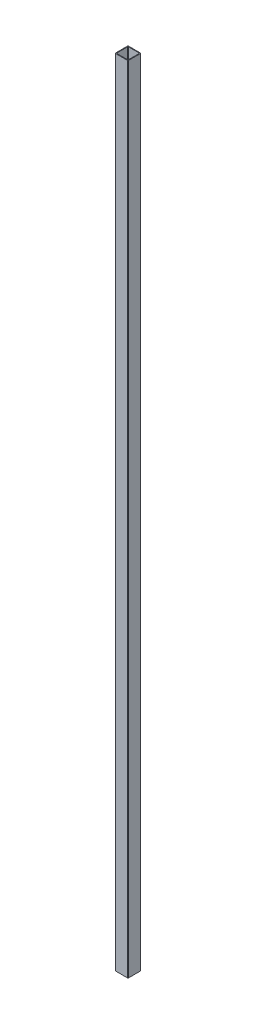
ISO-10303-21;
HEADER;
FILE_DESCRIPTION(('STEP AP214'),'2;1');
FILE_NAME('part.step','',(''),(''),'','','');
FILE_SCHEMA(('AUTOMOTIVE_DESIGN { 1 0 10303 214 1 1 1 1 }'));
ENDSEC;
DATA;
#1=APPLICATION_CONTEXT('core data for automotive mechanical design processes');
#2=APPLICATION_PROTOCOL_DEFINITION('international standard','automotive_design',2000,#1);
#3=PRODUCT_CONTEXT('',#1,'mechanical');
#4=PRODUCT('Part','Part','',(#3));
#5=PRODUCT_RELATED_PRODUCT_CATEGORY('part','',(#4));
#6=PRODUCT_DEFINITION_FORMATION('','',#4);
#7=PRODUCT_DEFINITION_CONTEXT('part definition',#1,'design');
#8=PRODUCT_DEFINITION('design','',#6,#7);
#9=PRODUCT_DEFINITION_SHAPE('','',#8);
#10=(LENGTH_UNIT() NAMED_UNIT(*) SI_UNIT(.MILLI.,.METRE.));
#11=(NAMED_UNIT(*) PLANE_ANGLE_UNIT() SI_UNIT($,.RADIAN.));
#12=(NAMED_UNIT(*) SI_UNIT($,.STERADIAN.) SOLID_ANGLE_UNIT());
#13=UNCERTAINTY_MEASURE_WITH_UNIT(LENGTH_MEASURE(1.E-05),#10,'distance_accuracy_value','');
#14=(GEOMETRIC_REPRESENTATION_CONTEXT(3) GLOBAL_UNCERTAINTY_ASSIGNED_CONTEXT((#13)) GLOBAL_UNIT_ASSIGNED_CONTEXT((#10,
#11,#12)) REPRESENTATION_CONTEXT('',''));
#15=CARTESIAN_POINT('',(0.,0.,0.));
#16=DIRECTION('',(0.,0.,1.));
#17=DIRECTION('',(1.,0.,0.));
#18=AXIS2_PLACEMENT_3D('',#15,#16,#17);
#19=CARTESIAN_POINT('',(18.,2460.,18.));
#20=DIRECTION('',(0.,1.,0.));
#21=DIRECTION('',(0.,0.,1.));
#22=AXIS2_PLACEMENT_3D('',#19,#20,#21);
#23=PLANE('',#22);
#24=CARTESIAN_POINT('',(18.,2460.,18.));
#25=DIRECTION('',(0.,1.,0.));
#26=DIRECTION('',(0.,0.,1.));
#27=AXIS2_PLACEMENT_3D('',#24,#25,#26);
#28=CIRCLE('',#27,2.);
#29=CARTESIAN_POINT('',(18.,2460.,20.));
#30=VERTEX_POINT('',#29);
#31=CARTESIAN_POINT('',(20.,2460.,18.));
#32=VERTEX_POINT('',#31);
#33=EDGE_CURVE('E212',#30,#32,#28,.T.);
#34=ORIENTED_EDGE('',*,*,#33,.T.);
#35=DIRECTION('',(0.,0.,-1.));
#36=VECTOR('',#35,1.);
#37=CARTESIAN_POINT('',(20.,2460.,-18.));
#38=LINE('',#37,#36);
#39=CARTESIAN_POINT('',(20.,2460.,-18.));
#40=VERTEX_POINT('',#39);
#41=EDGE_CURVE('E215',#32,#40,#38,.T.);
#42=ORIENTED_EDGE('',*,*,#41,.T.);
#43=CARTESIAN_POINT('',(18.,2460.,-18.));
#44=DIRECTION('',(0.,1.,0.));
#45=DIRECTION('',(0.,0.,-1.));
#46=AXIS2_PLACEMENT_3D('',#43,#44,#45);
#47=CIRCLE('',#46,2.);
#48=CARTESIAN_POINT('',(18.,2460.,-20.));
#49=VERTEX_POINT('',#48);
#50=EDGE_CURVE('E218',#40,#49,#47,.T.);
#51=ORIENTED_EDGE('',*,*,#50,.T.);
#52=DIRECTION('',(-1.,0.,0.));
#53=VECTOR('',#52,1.);
#54=CARTESIAN_POINT('',(-18.,2460.,-20.));
#55=LINE('',#54,#53);
#56=CARTESIAN_POINT('',(-18.,2460.,-20.));
#57=VERTEX_POINT('',#56);
#58=EDGE_CURVE('E220',#49,#57,#55,.T.);
#59=ORIENTED_EDGE('',*,*,#58,.T.);
#60=CARTESIAN_POINT('',(-18.,2460.,-18.));
#61=DIRECTION('',(0.,1.,0.));
#62=DIRECTION('',(0.,0.,1.));
#63=AXIS2_PLACEMENT_3D('',#60,#61,#62);
#64=CIRCLE('',#63,2.);
#65=CARTESIAN_POINT('',(-20.,2460.,-18.));
#66=VERTEX_POINT('',#65);
#67=EDGE_CURVE('E222',#57,#66,#64,.T.);
#68=ORIENTED_EDGE('',*,*,#67,.T.);
#69=DIRECTION('',(0.,0.,1.));
#70=VECTOR('',#69,1.);
#71=CARTESIAN_POINT('',(-20.,2460.,-18.));
#72=LINE('',#71,#70);
#73=CARTESIAN_POINT('',(-20.,2460.,18.));
#74=VERTEX_POINT('',#73);
#75=EDGE_CURVE('E224',#66,#74,#72,.T.);
#76=ORIENTED_EDGE('',*,*,#75,.T.);
#77=CARTESIAN_POINT('',(-18.,2460.,18.));
#78=DIRECTION('',(0.,1.,0.));
#79=DIRECTION('',(0.,0.,1.));
#80=AXIS2_PLACEMENT_3D('',#77,#78,#79);
#81=CIRCLE('',#80,2.);
#82=CARTESIAN_POINT('',(-18.,2460.,20.));
#83=VERTEX_POINT('',#82);
#84=EDGE_CURVE('E226',#74,#83,#81,.T.);
#85=ORIENTED_EDGE('',*,*,#84,.T.);
#86=DIRECTION('',(1.,0.,0.));
#87=VECTOR('',#86,1.);
#88=CARTESIAN_POINT('',(-18.,2460.,20.));
#89=LINE('',#88,#87);
#90=EDGE_CURVE('E228',#83,#30,#89,.T.);
#91=ORIENTED_EDGE('',*,*,#90,.T.);
#92=EDGE_LOOP('',(#34,#42,#51,#59,#68,#76,#85,#91));
#93=FACE_BOUND('',#92,.T.);
#94=DIRECTION('',(0.,0.,-1.));
#95=VECTOR('',#94,1.);
#96=CARTESIAN_POINT('',(18.,2460.,16.));
#97=LINE('',#96,#95);
#98=CARTESIAN_POINT('',(18.,2460.,16.));
#99=VERTEX_POINT('',#98);
#100=CARTESIAN_POINT('',(18.,2460.,-16.));
#101=VERTEX_POINT('',#100);
#102=EDGE_CURVE('E155',#99,#101,#97,.T.);
#103=ORIENTED_EDGE('',*,*,#102,.F.);
#104=CARTESIAN_POINT('',(16.,2460.,16.));
#105=DIRECTION('',(0.,1.,0.));
#106=DIRECTION('',(0.,0.,1.));
#107=AXIS2_PLACEMENT_3D('',#104,#105,#106);
#108=CIRCLE('',#107,2.);
#109=CARTESIAN_POINT('',(16.,2460.,18.));
#110=VERTEX_POINT('',#109);
#111=EDGE_CURVE('E147',#110,#99,#108,.T.);
#112=ORIENTED_EDGE('',*,*,#111,.F.);
#113=DIRECTION('',(1.,0.,0.));
#114=VECTOR('',#113,1.);
#115=CARTESIAN_POINT('',(16.,2460.,18.));
#116=LINE('',#115,#114);
#117=CARTESIAN_POINT('',(-16.,2460.,18.));
#118=VERTEX_POINT('',#117);
#119=EDGE_CURVE('E180',#118,#110,#116,.T.);
#120=ORIENTED_EDGE('',*,*,#119,.F.);
#121=CARTESIAN_POINT('',(-16.,2460.,16.));
#122=DIRECTION('',(0.,1.,0.));
#123=DIRECTION('',(0.,0.,-1.));
#124=AXIS2_PLACEMENT_3D('',#121,#122,#123);
#125=CIRCLE('',#124,2.);
#126=CARTESIAN_POINT('',(-18.,2460.,16.));
#127=VERTEX_POINT('',#126);
#128=EDGE_CURVE('E178',#127,#118,#125,.T.);
#129=ORIENTED_EDGE('',*,*,#128,.F.);
#130=DIRECTION('',(0.,0.,1.));
#131=VECTOR('',#130,1.);
#132=CARTESIAN_POINT('',(-18.,2460.,16.));
#133=LINE('',#132,#131);
#134=CARTESIAN_POINT('',(-18.,2460.,-16.));
#135=VERTEX_POINT('',#134);
#136=EDGE_CURVE('E176',#135,#127,#133,.T.);
#137=ORIENTED_EDGE('',*,*,#136,.F.);
#138=CARTESIAN_POINT('',(-16.,2460.,-16.));
#139=DIRECTION('',(0.,1.,0.));
#140=DIRECTION('',(0.,0.,1.));
#141=AXIS2_PLACEMENT_3D('',#138,#139,#140);
#142=CIRCLE('',#141,2.);
#143=CARTESIAN_POINT('',(-16.,2460.,-18.));
#144=VERTEX_POINT('',#143);
#145=EDGE_CURVE('E174',#144,#135,#142,.T.);
#146=ORIENTED_EDGE('',*,*,#145,.F.);
#147=DIRECTION('',(-1.,0.,0.));
#148=VECTOR('',#147,1.);
#149=CARTESIAN_POINT('',(16.,2460.,-18.));
#150=LINE('',#149,#148);
#151=CARTESIAN_POINT('',(16.,2460.,-18.));
#152=VERTEX_POINT('',#151);
#153=EDGE_CURVE('E170',#152,#144,#150,.T.);
#154=ORIENTED_EDGE('',*,*,#153,.F.);
#155=CARTESIAN_POINT('',(16.,2460.,-16.));
#156=DIRECTION('',(0.,1.,0.));
#157=DIRECTION('',(0.,0.,1.));
#158=AXIS2_PLACEMENT_3D('',#155,#156,#157);
#159=CIRCLE('',#158,2.);
#160=EDGE_CURVE('E168',#101,#152,#159,.T.);
#161=ORIENTED_EDGE('',*,*,#160,.F.);
#162=EDGE_LOOP('',(#103,#112,#120,#129,#137,#146,#154,#161));
#163=FACE_BOUND('',#162,.T.);
#164=ADVANCED_FACE('F34',(#93,#163),#23,.T.);
#165=CARTESIAN_POINT('',(18.,0.,18.));
#166=DIRECTION('',(0.,1.,0.));
#167=DIRECTION('',(0.,0.,1.));
#168=AXIS2_PLACEMENT_3D('',#165,#166,#167);
#169=PLANE('',#168);
#170=CARTESIAN_POINT('',(18.,0.,18.));
#171=DIRECTION('',(0.,1.,0.));
#172=DIRECTION('',(0.,0.,1.));
#173=AXIS2_PLACEMENT_3D('',#170,#171,#172);
#174=CIRCLE('',#173,2.);
#175=CARTESIAN_POINT('',(18.,0.,20.));
#176=VERTEX_POINT('',#175);
#177=CARTESIAN_POINT('',(20.,0.,18.));
#178=VERTEX_POINT('',#177);
#179=EDGE_CURVE('E163',#176,#178,#174,.T.);
#180=ORIENTED_EDGE('',*,*,#179,.F.);
#181=DIRECTION('',(1.,0.,0.));
#182=VECTOR('',#181,1.);
#183=CARTESIAN_POINT('',(-18.,0.,20.));
#184=LINE('',#183,#182);
#185=CARTESIAN_POINT('',(-18.,0.,20.));
#186=VERTEX_POINT('',#185);
#187=EDGE_CURVE('E216',#186,#176,#184,.T.);
#188=ORIENTED_EDGE('',*,*,#187,.F.);
#189=CARTESIAN_POINT('',(-18.,0.,18.));
#190=DIRECTION('',(0.,1.,0.));
#191=DIRECTION('',(0.,0.,1.));
#192=AXIS2_PLACEMENT_3D('',#189,#190,#191);
#193=CIRCLE('',#192,2.);
#194=CARTESIAN_POINT('',(-20.,0.,18.));
#195=VERTEX_POINT('',#194);
#196=EDGE_CURVE('E243',#195,#186,#193,.T.);
#197=ORIENTED_EDGE('',*,*,#196,.F.);
#198=DIRECTION('',(0.,0.,1.));
#199=VECTOR('',#198,1.);
#200=CARTESIAN_POINT('',(-20.,0.,-18.));
#201=LINE('',#200,#199);
#202=CARTESIAN_POINT('',(-20.,0.,-18.));
#203=VERTEX_POINT('',#202);
#204=EDGE_CURVE('E241',#203,#195,#201,.T.);
#205=ORIENTED_EDGE('',*,*,#204,.F.);
#206=CARTESIAN_POINT('',(-18.,0.,-18.));
#207=DIRECTION('',(0.,1.,0.));
#208=DIRECTION('',(0.,0.,1.));
#209=AXIS2_PLACEMENT_3D('',#206,#207,#208);
#210=CIRCLE('',#209,2.);
#211=CARTESIAN_POINT('',(-18.,0.,-20.));
#212=VERTEX_POINT('',#211);
#213=EDGE_CURVE('E239',#212,#203,#210,.T.);
#214=ORIENTED_EDGE('',*,*,#213,.F.);
#215=DIRECTION('',(-1.,0.,0.));
#216=VECTOR('',#215,1.);
#217=CARTESIAN_POINT('',(-18.,0.,-20.));
#218=LINE('',#217,#216);
#219=CARTESIAN_POINT('',(18.,0.,-20.));
#220=VERTEX_POINT('',#219);
#221=EDGE_CURVE('E237',#220,#212,#218,.T.);
#222=ORIENTED_EDGE('',*,*,#221,.F.);
#223=CARTESIAN_POINT('',(18.,0.,-18.));
#224=DIRECTION('',(0.,1.,0.));
#225=DIRECTION('',(0.,0.,-1.));
#226=AXIS2_PLACEMENT_3D('',#223,#224,#225);
#227=CIRCLE('',#226,2.);
#228=CARTESIAN_POINT('',(20.,0.,-18.));
#229=VERTEX_POINT('',#228);
#230=EDGE_CURVE('E235',#229,#220,#227,.T.);
#231=ORIENTED_EDGE('',*,*,#230,.F.);
#232=DIRECTION('',(0.,0.,-1.));
#233=VECTOR('',#232,1.);
#234=CARTESIAN_POINT('',(20.,0.,-18.));
#235=LINE('',#234,#233);
#236=EDGE_CURVE('E233',#178,#229,#235,.T.);
#237=ORIENTED_EDGE('',*,*,#236,.F.);
#238=EDGE_LOOP('',(#180,#188,#197,#205,#214,#222,#231,#237));
#239=FACE_BOUND('',#238,.T.);
#240=CARTESIAN_POINT('',(16.,0.,16.));
#241=DIRECTION('',(0.,1.,0.));
#242=DIRECTION('',(0.,0.,1.));
#243=AXIS2_PLACEMENT_3D('',#240,#241,#242);
#244=CIRCLE('',#243,2.);
#245=CARTESIAN_POINT('',(16.,0.,18.));
#246=VERTEX_POINT('',#245);
#247=CARTESIAN_POINT('',(18.,0.,16.));
#248=VERTEX_POINT('',#247);
#249=EDGE_CURVE('E57',#246,#248,#244,.T.);
#250=ORIENTED_EDGE('',*,*,#249,.T.);
#251=DIRECTION('',(0.,0.,-1.));
#252=VECTOR('',#251,1.);
#253=CARTESIAN_POINT('',(18.,0.,16.));
#254=LINE('',#253,#252);
#255=CARTESIAN_POINT('',(18.,0.,-16.));
#256=VERTEX_POINT('',#255);
#257=EDGE_CURVE('E162',#248,#256,#254,.T.);
#258=ORIENTED_EDGE('',*,*,#257,.T.);
#259=CARTESIAN_POINT('',(16.,0.,-16.));
#260=DIRECTION('',(0.,1.,0.));
#261=DIRECTION('',(0.,0.,1.));
#262=AXIS2_PLACEMENT_3D('',#259,#260,#261);
#263=CIRCLE('',#262,2.);
#264=CARTESIAN_POINT('',(16.,0.,-18.));
#265=VERTEX_POINT('',#264);
#266=EDGE_CURVE('E184',#256,#265,#263,.T.);
#267=ORIENTED_EDGE('',*,*,#266,.T.);
#268=DIRECTION('',(-1.,0.,0.));
#269=VECTOR('',#268,1.);
#270=CARTESIAN_POINT('',(16.,0.,-18.));
#271=LINE('',#270,#269);
#272=CARTESIAN_POINT('',(-16.,0.,-18.));
#273=VERTEX_POINT('',#272);
#274=EDGE_CURVE('E187',#265,#273,#271,.T.);
#275=ORIENTED_EDGE('',*,*,#274,.T.);
#276=CARTESIAN_POINT('',(-16.,0.,-16.));
#277=DIRECTION('',(0.,1.,0.));
#278=DIRECTION('',(0.,0.,1.));
#279=AXIS2_PLACEMENT_3D('',#276,#277,#278);
#280=CIRCLE('',#279,2.);
#281=CARTESIAN_POINT('',(-18.,0.,-16.));
#282=VERTEX_POINT('',#281);
#283=EDGE_CURVE('E190',#273,#282,#280,.T.);
#284=ORIENTED_EDGE('',*,*,#283,.T.);
#285=DIRECTION('',(0.,0.,1.));
#286=VECTOR('',#285,1.);
#287=CARTESIAN_POINT('',(-18.,0.,16.));
#288=LINE('',#287,#286);
#289=CARTESIAN_POINT('',(-18.,0.,16.));
#290=VERTEX_POINT('',#289);
#291=EDGE_CURVE('E193',#282,#290,#288,.T.);
#292=ORIENTED_EDGE('',*,*,#291,.T.);
#293=CARTESIAN_POINT('',(-16.,0.,16.));
#294=DIRECTION('',(0.,1.,0.));
#295=DIRECTION('',(0.,0.,-1.));
#296=AXIS2_PLACEMENT_3D('',#293,#294,#295);
#297=CIRCLE('',#296,2.);
#298=CARTESIAN_POINT('',(-16.,0.,18.));
#299=VERTEX_POINT('',#298);
#300=EDGE_CURVE('E196',#290,#299,#297,.T.);
#301=ORIENTED_EDGE('',*,*,#300,.T.);
#302=DIRECTION('',(1.,0.,0.));
#303=VECTOR('',#302,1.);
#304=CARTESIAN_POINT('',(16.,0.,18.));
#305=LINE('',#304,#303);
#306=EDGE_CURVE('E156',#299,#246,#305,.T.);
#307=ORIENTED_EDGE('',*,*,#306,.T.);
#308=EDGE_LOOP('',(#250,#258,#267,#275,#284,#292,#301,#307));
#309=FACE_BOUND('',#308,.T.);
#310=ADVANCED_FACE('F273',(#239,#309),#169,.F.);
#311=CARTESIAN_POINT('',(18.,2460.,18.));
#312=DIRECTION('',(0.,-1.,0.));
#313=DIRECTION('',(0.,0.,-1.));
#314=AXIS2_PLACEMENT_3D('',#311,#312,#313);
#315=CYLINDRICAL_SURFACE('',#314,2.);
#316=ORIENTED_EDGE('',*,*,#179,.T.);
#317=DIRECTION('',(0.,-1.,0.));
#318=VECTOR('',#317,1.);
#319=CARTESIAN_POINT('',(20.,2460.,18.));
#320=LINE('',#319,#318);
#321=EDGE_CURVE('E11',#32,#178,#320,.T.);
#322=ORIENTED_EDGE('',*,*,#321,.F.);
#323=ORIENTED_EDGE('',*,*,#33,.F.);
#324=DIRECTION('',(0.,-1.,0.));
#325=VECTOR('',#324,1.);
#326=CARTESIAN_POINT('',(18.,2460.,20.));
#327=LINE('',#326,#325);
#328=EDGE_CURVE('E230',#30,#176,#327,.T.);
#329=ORIENTED_EDGE('',*,*,#328,.T.);
#330=EDGE_LOOP('',(#316,#322,#323,#329));
#331=FACE_BOUND('',#330,.T.);
#332=ADVANCED_FACE('F36',(#331),#315,.T.);
#333=CARTESIAN_POINT('',(20.,2460.,-18.));
#334=DIRECTION('',(-1.,0.,0.));
#335=DIRECTION('',(0.,0.,1.));
#336=AXIS2_PLACEMENT_3D('',#333,#334,#335);
#337=PLANE('',#336);
#338=ORIENTED_EDGE('',*,*,#236,.T.);
#339=DIRECTION('',(0.,-1.,0.));
#340=VECTOR('',#339,1.);
#341=CARTESIAN_POINT('',(20.,2460.,-18.));
#342=LINE('',#341,#340);
#343=EDGE_CURVE('E42',#40,#229,#342,.T.);
#344=ORIENTED_EDGE('',*,*,#343,.F.);
#345=ORIENTED_EDGE('',*,*,#41,.F.);
#346=ORIENTED_EDGE('',*,*,#321,.T.);
#347=EDGE_LOOP('',(#338,#344,#345,#346));
#348=FACE_BOUND('',#347,.T.);
#349=ADVANCED_FACE('F290',(#348),#337,.F.);
#350=CARTESIAN_POINT('',(18.,2460.,-18.));
#351=DIRECTION('',(0.,-1.,0.));
#352=DIRECTION('',(0.,0.,-1.));
#353=AXIS2_PLACEMENT_3D('',#350,#351,#352);
#354=CYLINDRICAL_SURFACE('',#353,2.);
#355=ORIENTED_EDGE('',*,*,#230,.T.);
#356=DIRECTION('',(0.,-1.,0.));
#357=VECTOR('',#356,1.);
#358=CARTESIAN_POINT('',(18.,2460.,-20.));
#359=LINE('',#358,#357);
#360=EDGE_CURVE('E260',#49,#220,#359,.T.);
#361=ORIENTED_EDGE('',*,*,#360,.F.);
#362=ORIENTED_EDGE('',*,*,#50,.F.);
#363=ORIENTED_EDGE('',*,*,#343,.T.);
#364=EDGE_LOOP('',(#355,#361,#362,#363));
#365=FACE_BOUND('',#364,.T.);
#366=ADVANCED_FACE('F267',(#365),#354,.T.);
#367=CARTESIAN_POINT('',(-18.,2460.,-20.));
#368=DIRECTION('',(0.,0.,1.));
#369=DIRECTION('',(1.,0.,0.));
#370=AXIS2_PLACEMENT_3D('',#367,#368,#369);
#371=PLANE('',#370);
#372=ORIENTED_EDGE('',*,*,#221,.T.);
#373=DIRECTION('',(0.,-1.,0.));
#374=VECTOR('',#373,1.);
#375=CARTESIAN_POINT('',(-18.,2460.,-20.));
#376=LINE('',#375,#374);
#377=EDGE_CURVE('E257',#57,#212,#376,.T.);
#378=ORIENTED_EDGE('',*,*,#377,.F.);
#379=ORIENTED_EDGE('',*,*,#58,.F.);
#380=ORIENTED_EDGE('',*,*,#360,.T.);
#381=EDGE_LOOP('',(#372,#378,#379,#380));
#382=FACE_BOUND('',#381,.T.);
#383=ADVANCED_FACE('F279',(#382),#371,.F.);
#384=CARTESIAN_POINT('',(-18.,2460.,-18.));
#385=DIRECTION('',(0.,-1.,0.));
#386=DIRECTION('',(0.,0.,-1.));
#387=AXIS2_PLACEMENT_3D('',#384,#385,#386);
#388=CYLINDRICAL_SURFACE('',#387,2.);
#389=ORIENTED_EDGE('',*,*,#213,.T.);
#390=DIRECTION('',(0.,-1.,0.));
#391=VECTOR('',#390,1.);
#392=CARTESIAN_POINT('',(-20.,2460.,-18.));
#393=LINE('',#392,#391);
#394=EDGE_CURVE('E254',#66,#203,#393,.T.);
#395=ORIENTED_EDGE('',*,*,#394,.F.);
#396=ORIENTED_EDGE('',*,*,#67,.F.);
#397=ORIENTED_EDGE('',*,*,#377,.T.);
#398=EDGE_LOOP('',(#389,#395,#396,#397));
#399=FACE_BOUND('',#398,.T.);
#400=ADVANCED_FACE('F283',(#399),#388,.T.);
#401=CARTESIAN_POINT('',(-20.,2460.,-18.));
#402=DIRECTION('',(1.,0.,0.));
#403=DIRECTION('',(0.,0.,-1.));
#404=AXIS2_PLACEMENT_3D('',#401,#402,#403);
#405=PLANE('',#404);
#406=ORIENTED_EDGE('',*,*,#204,.T.);
#407=DIRECTION('',(0.,-1.,0.));
#408=VECTOR('',#407,1.);
#409=CARTESIAN_POINT('',(-20.,2460.,18.));
#410=LINE('',#409,#408);
#411=EDGE_CURVE('E251',#74,#195,#410,.T.);
#412=ORIENTED_EDGE('',*,*,#411,.F.);
#413=ORIENTED_EDGE('',*,*,#75,.F.);
#414=ORIENTED_EDGE('',*,*,#394,.T.);
#415=EDGE_LOOP('',(#406,#412,#413,#414));
#416=FACE_BOUND('',#415,.T.);
#417=ADVANCED_FACE('F303',(#416),#405,.F.);
#418=CARTESIAN_POINT('',(-18.,2460.,18.));
#419=DIRECTION('',(0.,-1.,0.));
#420=DIRECTION('',(0.,0.,-1.));
#421=AXIS2_PLACEMENT_3D('',#418,#419,#420);
#422=CYLINDRICAL_SURFACE('',#421,2.);
#423=ORIENTED_EDGE('',*,*,#196,.T.);
#424=DIRECTION('',(0.,-1.,0.));
#425=VECTOR('',#424,1.);
#426=CARTESIAN_POINT('',(-18.,2460.,20.));
#427=LINE('',#426,#425);
#428=EDGE_CURVE('E248',#83,#186,#427,.T.);
#429=ORIENTED_EDGE('',*,*,#428,.F.);
#430=ORIENTED_EDGE('',*,*,#84,.F.);
#431=ORIENTED_EDGE('',*,*,#411,.T.);
#432=EDGE_LOOP('',(#423,#429,#430,#431));
#433=FACE_BOUND('',#432,.T.);
#434=ADVANCED_FACE('F301',(#433),#422,.T.);
#435=CARTESIAN_POINT('',(-18.,2460.,20.));
#436=DIRECTION('',(0.,0.,-1.));
#437=DIRECTION('',(-1.,0.,0.));
#438=AXIS2_PLACEMENT_3D('',#435,#436,#437);
#439=PLANE('',#438);
#440=ORIENTED_EDGE('',*,*,#187,.T.);
#441=ORIENTED_EDGE('',*,*,#328,.F.);
#442=ORIENTED_EDGE('',*,*,#90,.F.);
#443=ORIENTED_EDGE('',*,*,#428,.T.);
#444=EDGE_LOOP('',(#440,#441,#442,#443));
#445=FACE_BOUND('',#444,.T.);
#446=ADVANCED_FACE('F296',(#445),#439,.F.);
#447=CARTESIAN_POINT('',(16.,2460.,16.));
#448=DIRECTION('',(0.,-1.,0.));
#449=DIRECTION('',(0.,0.,-1.));
#450=AXIS2_PLACEMENT_3D('',#447,#448,#449);
#451=CYLINDRICAL_SURFACE('',#450,2.);
#452=ORIENTED_EDGE('',*,*,#249,.F.);
#453=DIRECTION('',(0.,-1.,0.));
#454=VECTOR('',#453,1.);
#455=CARTESIAN_POINT('',(16.,2460.,18.));
#456=LINE('',#455,#454);
#457=EDGE_CURVE('E151',#110,#246,#456,.T.);
#458=ORIENTED_EDGE('',*,*,#457,.F.);
#459=ORIENTED_EDGE('',*,*,#111,.T.);
#460=DIRECTION('',(0.,-1.,0.));
#461=VECTOR('',#460,1.);
#462=CARTESIAN_POINT('',(18.,2460.,16.));
#463=LINE('',#462,#461);
#464=EDGE_CURVE('E150',#99,#248,#463,.T.);
#465=ORIENTED_EDGE('',*,*,#464,.T.);
#466=EDGE_LOOP('',(#452,#458,#459,#465));
#467=FACE_BOUND('',#466,.T.);
#468=ADVANCED_FACE('F149',(#467),#451,.F.);
#469=CARTESIAN_POINT('',(18.,2460.,16.));
#470=DIRECTION('',(-1.,0.,0.));
#471=DIRECTION('',(0.,0.,1.));
#472=AXIS2_PLACEMENT_3D('',#469,#470,#471);
#473=PLANE('',#472);
#474=ORIENTED_EDGE('',*,*,#257,.F.);
#475=ORIENTED_EDGE('',*,*,#464,.F.);
#476=ORIENTED_EDGE('',*,*,#102,.T.);
#477=DIRECTION('',(0.,-1.,0.));
#478=VECTOR('',#477,1.);
#479=CARTESIAN_POINT('',(18.,2460.,-16.));
#480=LINE('',#479,#478);
#481=EDGE_CURVE('E164',#101,#256,#480,.T.);
#482=ORIENTED_EDGE('',*,*,#481,.T.);
#483=EDGE_LOOP('',(#474,#475,#476,#482));
#484=FACE_BOUND('',#483,.T.);
#485=ADVANCED_FACE('F159',(#484),#473,.T.);
#486=CARTESIAN_POINT('',(16.,2460.,-16.));
#487=DIRECTION('',(0.,-1.,0.));
#488=DIRECTION('',(0.,0.,-1.));
#489=AXIS2_PLACEMENT_3D('',#486,#487,#488);
#490=CYLINDRICAL_SURFACE('',#489,2.);
#491=ORIENTED_EDGE('',*,*,#266,.F.);
#492=ORIENTED_EDGE('',*,*,#481,.F.);
#493=ORIENTED_EDGE('',*,*,#160,.T.);
#494=DIRECTION('',(0.,-1.,0.));
#495=VECTOR('',#494,1.);
#496=CARTESIAN_POINT('',(16.,2460.,-18.));
#497=LINE('',#496,#495);
#498=EDGE_CURVE('E209',#152,#265,#497,.T.);
#499=ORIENTED_EDGE('',*,*,#498,.T.);
#500=EDGE_LOOP('',(#491,#492,#493,#499));
#501=FACE_BOUND('',#500,.T.);
#502=ADVANCED_FACE('F328',(#501),#490,.F.);
#503=CARTESIAN_POINT('',(16.,2460.,-18.));
#504=DIRECTION('',(0.,0.,1.));
#505=DIRECTION('',(1.,0.,0.));
#506=AXIS2_PLACEMENT_3D('',#503,#504,#505);
#507=PLANE('',#506);
#508=ORIENTED_EDGE('',*,*,#274,.F.);
#509=ORIENTED_EDGE('',*,*,#498,.F.);
#510=ORIENTED_EDGE('',*,*,#153,.T.);
#511=DIRECTION('',(0.,-1.,0.));
#512=VECTOR('',#511,1.);
#513=CARTESIAN_POINT('',(-16.,2460.,-18.));
#514=LINE('',#513,#512);
#515=EDGE_CURVE('E207',#144,#273,#514,.T.);
#516=ORIENTED_EDGE('',*,*,#515,.T.);
#517=EDGE_LOOP('',(#508,#509,#510,#516));
#518=FACE_BOUND('',#517,.T.);
#519=ADVANCED_FACE('F332',(#518),#507,.T.);
#520=CARTESIAN_POINT('',(-16.,2460.,-16.));
#521=DIRECTION('',(0.,-1.,0.));
#522=DIRECTION('',(0.,0.,-1.));
#523=AXIS2_PLACEMENT_3D('',#520,#521,#522);
#524=CYLINDRICAL_SURFACE('',#523,2.);
#525=ORIENTED_EDGE('',*,*,#283,.F.);
#526=ORIENTED_EDGE('',*,*,#515,.F.);
#527=ORIENTED_EDGE('',*,*,#145,.T.);
#528=DIRECTION('',(0.,-1.,0.));
#529=VECTOR('',#528,1.);
#530=CARTESIAN_POINT('',(-18.,2460.,-16.));
#531=LINE('',#530,#529);
#532=EDGE_CURVE('E205',#135,#282,#531,.T.);
#533=ORIENTED_EDGE('',*,*,#532,.T.);
#534=EDGE_LOOP('',(#525,#526,#527,#533));
#535=FACE_BOUND('',#534,.T.);
#536=ADVANCED_FACE('F338',(#535),#524,.F.);
#537=CARTESIAN_POINT('',(-18.,2460.,16.));
#538=DIRECTION('',(1.,0.,0.));
#539=DIRECTION('',(0.,0.,-1.));
#540=AXIS2_PLACEMENT_3D('',#537,#538,#539);
#541=PLANE('',#540);
#542=ORIENTED_EDGE('',*,*,#291,.F.);
#543=ORIENTED_EDGE('',*,*,#532,.F.);
#544=ORIENTED_EDGE('',*,*,#136,.T.);
#545=DIRECTION('',(0.,-1.,0.));
#546=VECTOR('',#545,1.);
#547=CARTESIAN_POINT('',(-18.,2460.,16.));
#548=LINE('',#547,#546);
#549=EDGE_CURVE('E203',#127,#290,#548,.T.);
#550=ORIENTED_EDGE('',*,*,#549,.T.);
#551=EDGE_LOOP('',(#542,#543,#544,#550));
#552=FACE_BOUND('',#551,.T.);
#553=ADVANCED_FACE('F342',(#552),#541,.T.);
#554=CARTESIAN_POINT('',(-16.,2460.,16.));
#555=DIRECTION('',(0.,-1.,0.));
#556=DIRECTION('',(0.,0.,-1.));
#557=AXIS2_PLACEMENT_3D('',#554,#555,#556);
#558=CYLINDRICAL_SURFACE('',#557,2.);
#559=ORIENTED_EDGE('',*,*,#300,.F.);
#560=ORIENTED_EDGE('',*,*,#549,.F.);
#561=ORIENTED_EDGE('',*,*,#128,.T.);
#562=DIRECTION('',(0.,-1.,0.));
#563=VECTOR('',#562,1.);
#564=CARTESIAN_POINT('',(-16.,2460.,18.));
#565=LINE('',#564,#563);
#566=EDGE_CURVE('E49',#118,#299,#565,.T.);
#567=ORIENTED_EDGE('',*,*,#566,.T.);
#568=EDGE_LOOP('',(#559,#560,#561,#567));
#569=FACE_BOUND('',#568,.T.);
#570=ADVANCED_FACE('F346',(#569),#558,.F.);
#571=CARTESIAN_POINT('',(16.,2460.,18.));
#572=DIRECTION('',(0.,0.,-1.));
#573=DIRECTION('',(-1.,0.,0.));
#574=AXIS2_PLACEMENT_3D('',#571,#572,#573);
#575=PLANE('',#574);
#576=ORIENTED_EDGE('',*,*,#306,.F.);
#577=ORIENTED_EDGE('',*,*,#566,.F.);
#578=ORIENTED_EDGE('',*,*,#119,.T.);
#579=ORIENTED_EDGE('',*,*,#457,.T.);
#580=EDGE_LOOP('',(#576,#577,#578,#579));
#581=FACE_BOUND('',#580,.T.);
#582=ADVANCED_FACE('F350',(#581),#575,.T.);
#583=CLOSED_SHELL('',(#164,#310,#332,#349,#366,#383,#400,#417,#434,#446,#468,#485,#502,#519,
#536,#553,#570,#582));
#584=MANIFOLD_SOLID_BREP('B2',#583);
#585=ADVANCED_BREP_SHAPE_REPRESENTATION('',(#18,#584),#14);
#586=SHAPE_DEFINITION_REPRESENTATION(#9,#585);
ENDSEC;
END-ISO-10303-21;
